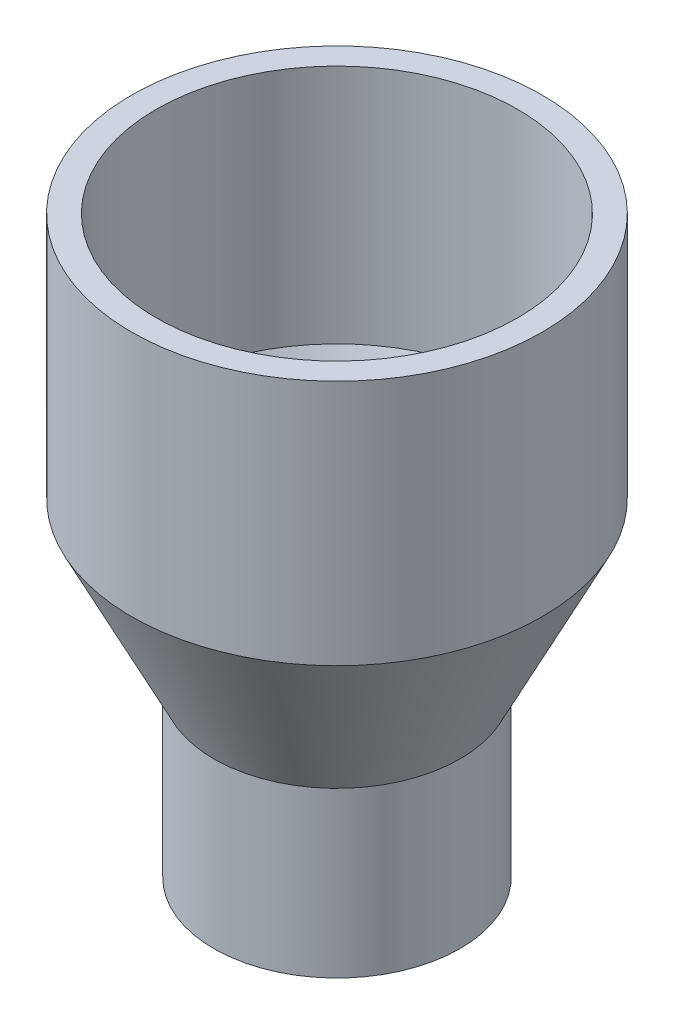
ISO-10303-21;
HEADER;
FILE_DESCRIPTION(('STEP AP214'),'2;1');
FILE_NAME('part.step','',(''),(''),'','','');
FILE_SCHEMA(('AUTOMOTIVE_DESIGN { 1 0 10303 214 1 1 1 1 }'));
ENDSEC;
DATA;
#1=APPLICATION_CONTEXT('core data for automotive mechanical design processes');
#2=APPLICATION_PROTOCOL_DEFINITION('international standard','automotive_design',2000,#1);
#3=PRODUCT_CONTEXT('',#1,'mechanical');
#4=PRODUCT('Part','Part','',(#3));
#5=PRODUCT_RELATED_PRODUCT_CATEGORY('part','',(#4));
#6=PRODUCT_DEFINITION_FORMATION('','',#4);
#7=PRODUCT_DEFINITION_CONTEXT('part definition',#1,'design');
#8=PRODUCT_DEFINITION('design','',#6,#7);
#9=PRODUCT_DEFINITION_SHAPE('','',#8);
#10=(LENGTH_UNIT() NAMED_UNIT(*) SI_UNIT(.MILLI.,.METRE.));
#11=(NAMED_UNIT(*) PLANE_ANGLE_UNIT() SI_UNIT($,.RADIAN.));
#12=(NAMED_UNIT(*) SI_UNIT($,.STERADIAN.) SOLID_ANGLE_UNIT());
#13=UNCERTAINTY_MEASURE_WITH_UNIT(LENGTH_MEASURE(1.E-05),#10,'distance_accuracy_value','');
#14=(GEOMETRIC_REPRESENTATION_CONTEXT(3) GLOBAL_UNCERTAINTY_ASSIGNED_CONTEXT((#13)) GLOBAL_UNIT_ASSIGNED_CONTEXT((#10,
#11,#12)) REPRESENTATION_CONTEXT('',''));
#15=CARTESIAN_POINT('',(0.,0.,0.));
#16=DIRECTION('',(0.,0.,1.));
#17=DIRECTION('',(1.,0.,0.));
#18=AXIS2_PLACEMENT_3D('',#15,#16,#17);
#19=CARTESIAN_POINT('',(11.,17.5,0.));
#20=DIRECTION('',(0.,1.,0.));
#21=DIRECTION('',(-1.,0.,0.));
#22=AXIS2_PLACEMENT_3D('',#19,#20,#21);
#23=PLANE('',#22);
#24=CARTESIAN_POINT('',(0.,17.5,0.));
#25=DIRECTION('',(0.,-1.,0.));
#26=DIRECTION('',(1.,0.,0.));
#27=AXIS2_PLACEMENT_3D('',#24,#25,#26);
#28=CIRCLE('',#27,11.);
#29=CARTESIAN_POINT('',(11.,17.5,0.));
#30=VERTEX_POINT('',#29);
#31=EDGE_CURVE('E59',#30,#30,#28,.T.);
#32=ORIENTED_EDGE('',*,*,#31,.T.);
#33=EDGE_LOOP('',(#32));
#34=FACE_BOUND('',#33,.T.);
#35=CARTESIAN_POINT('',(0.,17.5,0.));
#36=DIRECTION('',(0.,-1.,0.));
#37=DIRECTION('',(1.,0.,0.));
#38=AXIS2_PLACEMENT_3D('',#35,#36,#37);
#39=CIRCLE('',#38,12.5);
#40=CARTESIAN_POINT('',(12.5,17.5,0.));
#41=VERTEX_POINT('',#40);
#42=EDGE_CURVE('E10',#41,#41,#39,.T.);
#43=ORIENTED_EDGE('',*,*,#42,.F.);
#44=EDGE_LOOP('',(#43));
#45=FACE_BOUND('',#44,.T.);
#46=ADVANCED_FACE('F31',(#34,#45),#23,.T.);
#47=CARTESIAN_POINT('',(0.,-17.5,0.));
#48=DIRECTION('',(0.,-1.,0.));
#49=DIRECTION('',(1.,0.,0.));
#50=AXIS2_PLACEMENT_3D('',#47,#48,#49);
#51=CYLINDRICAL_SURFACE('',#50,12.5);
#52=ORIENTED_EDGE('',*,*,#42,.T.);
#53=EDGE_LOOP('',(#52));
#54=FACE_BOUND('',#53,.T.);
#55=CARTESIAN_POINT('',(0.,2.5,0.));
#56=DIRECTION('',(0.,-1.,0.));
#57=DIRECTION('',(1.,0.,0.));
#58=AXIS2_PLACEMENT_3D('',#55,#56,#57);
#59=CIRCLE('',#58,12.5);
#60=CARTESIAN_POINT('',(12.5,2.5,0.));
#61=VERTEX_POINT('',#60);
#62=EDGE_CURVE('E37',#61,#61,#59,.T.);
#63=ORIENTED_EDGE('',*,*,#62,.F.);
#64=EDGE_LOOP('',(#63));
#65=FACE_BOUND('',#64,.T.);
#66=ADVANCED_FACE('F77',(#54,#65),#51,.T.);
#67=CARTESIAN_POINT('',(0.,-7.5,0.));
#68=DIRECTION('',(0.,1.,0.));
#69=DIRECTION('',(-1.,0.,0.));
#70=AXIS2_PLACEMENT_3D('',#67,#68,#69);
#71=CONICAL_SURFACE('',#70,7.5,0.463647609000805);
#72=ORIENTED_EDGE('',*,*,#62,.T.);
#73=EDGE_LOOP('',(#72));
#74=FACE_BOUND('',#73,.T.);
#75=CARTESIAN_POINT('',(0.,-7.5,0.));
#76=DIRECTION('',(0.,-1.,0.));
#77=DIRECTION('',(1.,0.,0.));
#78=AXIS2_PLACEMENT_3D('',#75,#76,#77);
#79=CIRCLE('',#78,7.5);
#80=CARTESIAN_POINT('',(7.5,-7.5,0.));
#81=VERTEX_POINT('',#80);
#82=EDGE_CURVE('E41',#81,#81,#79,.T.);
#83=ORIENTED_EDGE('',*,*,#82,.F.);
#84=EDGE_LOOP('',(#83));
#85=FACE_BOUND('',#84,.T.);
#86=ADVANCED_FACE('F81',(#74,#85),#71,.T.);
#87=CARTESIAN_POINT('',(0.,-17.5,0.));
#88=DIRECTION('',(0.,-1.,0.));
#89=DIRECTION('',(1.,0.,0.));
#90=AXIS2_PLACEMENT_3D('',#87,#88,#89);
#91=CYLINDRICAL_SURFACE('',#90,7.5);
#92=ORIENTED_EDGE('',*,*,#82,.T.);
#93=EDGE_LOOP('',(#92));
#94=FACE_BOUND('',#93,.T.);
#95=CARTESIAN_POINT('',(0.,-17.5,0.));
#96=DIRECTION('',(0.,-1.,0.));
#97=DIRECTION('',(1.,0.,0.));
#98=AXIS2_PLACEMENT_3D('',#95,#96,#97);
#99=CIRCLE('',#98,7.5);
#100=CARTESIAN_POINT('',(7.5,-17.5,0.));
#101=VERTEX_POINT('',#100);
#102=EDGE_CURVE('E45',#101,#101,#99,.T.);
#103=ORIENTED_EDGE('',*,*,#102,.F.);
#104=EDGE_LOOP('',(#103));
#105=FACE_BOUND('',#104,.T.);
#106=ADVANCED_FACE('F85',(#94,#105),#91,.T.);
#107=CARTESIAN_POINT('',(7.5,-17.5,0.));
#108=DIRECTION('',(0.,-1.,0.));
#109=DIRECTION('',(1.,0.,0.));
#110=AXIS2_PLACEMENT_3D('',#107,#108,#109);
#111=PLANE('',#110);
#112=ORIENTED_EDGE('',*,*,#102,.T.);
#113=EDGE_LOOP('',(#112));
#114=FACE_BOUND('',#113,.T.);
#115=CARTESIAN_POINT('',(0.,-17.5,0.));
#116=DIRECTION('',(0.,-1.,0.));
#117=DIRECTION('',(1.,0.,0.));
#118=AXIS2_PLACEMENT_3D('',#115,#116,#117);
#119=CIRCLE('',#118,6.);
#120=CARTESIAN_POINT('',(6.,-17.5,0.));
#121=VERTEX_POINT('',#120);
#122=EDGE_CURVE('E50',#121,#121,#119,.T.);
#123=ORIENTED_EDGE('',*,*,#122,.F.);
#124=EDGE_LOOP('',(#123));
#125=FACE_BOUND('',#124,.T.);
#126=ADVANCED_FACE('F91',(#114,#125),#111,.T.);
#127=CARTESIAN_POINT('',(0.,-17.5,0.));
#128=DIRECTION('',(0.,-1.,0.));
#129=DIRECTION('',(1.,0.,0.));
#130=AXIS2_PLACEMENT_3D('',#127,#128,#129);
#131=CYLINDRICAL_SURFACE('',#130,6.);
#132=ORIENTED_EDGE('',*,*,#122,.T.);
#133=EDGE_LOOP('',(#132));
#134=FACE_BOUND('',#133,.T.);
#135=CARTESIAN_POINT('',(0.,-7.14589803375032,0.));
#136=DIRECTION('',(0.,-1.,0.));
#137=DIRECTION('',(1.,0.,0.));
#138=AXIS2_PLACEMENT_3D('',#135,#136,#137);
#139=CIRCLE('',#138,6.);
#140=CARTESIAN_POINT('',(6.,-7.14589803375032,0.));
#141=VERTEX_POINT('',#140);
#142=EDGE_CURVE('E53',#141,#141,#139,.T.);
#143=ORIENTED_EDGE('',*,*,#142,.F.);
#144=EDGE_LOOP('',(#143));
#145=FACE_BOUND('',#144,.T.);
#146=ADVANCED_FACE('F73',(#134,#145),#131,.F.);
#147=CARTESIAN_POINT('',(0.,2.85410196624969,0.));
#148=DIRECTION('',(0.,1.,0.));
#149=DIRECTION('',(-1.,0.,0.));
#150=AXIS2_PLACEMENT_3D('',#147,#148,#149);
#151=CONICAL_SURFACE('',#150,11.,0.463647609000806);
#152=ORIENTED_EDGE('',*,*,#142,.T.);
#153=EDGE_LOOP('',(#152));
#154=FACE_BOUND('',#153,.T.);
#155=CARTESIAN_POINT('',(0.,2.85410196624969,0.));
#156=DIRECTION('',(0.,-1.,0.));
#157=DIRECTION('',(1.,0.,0.));
#158=AXIS2_PLACEMENT_3D('',#155,#156,#157);
#159=CIRCLE('',#158,11.);
#160=CARTESIAN_POINT('',(11.,2.85410196624969,0.));
#161=VERTEX_POINT('',#160);
#162=EDGE_CURVE('E56',#161,#161,#159,.T.);
#163=ORIENTED_EDGE('',*,*,#162,.F.);
#164=EDGE_LOOP('',(#163));
#165=FACE_BOUND('',#164,.T.);
#166=ADVANCED_FACE('F67',(#154,#165),#151,.F.);
#167=CARTESIAN_POINT('',(0.,-17.5,0.));
#168=DIRECTION('',(0.,-1.,0.));
#169=DIRECTION('',(1.,0.,0.));
#170=AXIS2_PLACEMENT_3D('',#167,#168,#169);
#171=CYLINDRICAL_SURFACE('',#170,11.);
#172=ORIENTED_EDGE('',*,*,#162,.T.);
#173=EDGE_LOOP('',(#172));
#174=FACE_BOUND('',#173,.T.);
#175=ORIENTED_EDGE('',*,*,#31,.F.);
#176=EDGE_LOOP('',(#175));
#177=FACE_BOUND('',#176,.T.);
#178=ADVANCED_FACE('F65',(#174,#177),#171,.F.);
#179=CLOSED_SHELL('',(#46,#66,#86,#106,#126,#146,#166,#178));
#180=MANIFOLD_SOLID_BREP('B2',#179);
#181=ADVANCED_BREP_SHAPE_REPRESENTATION('',(#18,#180),#14);
#182=SHAPE_DEFINITION_REPRESENTATION(#9,#181);
ENDSEC;
END-ISO-10303-21;
